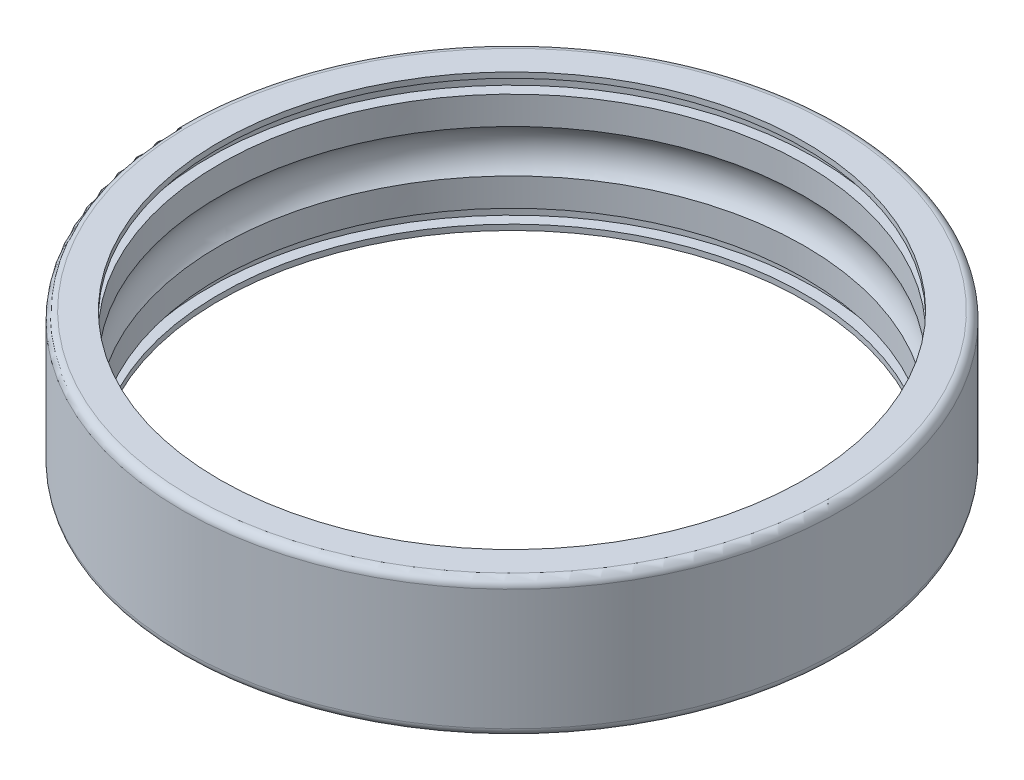
ISO-10303-21;
HEADER;
FILE_DESCRIPTION(('STEP AP214'),'2;1');
FILE_NAME('part.step','',(''),(''),'','','');
FILE_SCHEMA(('AUTOMOTIVE_DESIGN { 1 0 10303 214 1 1 1 1 }'));
ENDSEC;
DATA;
#1=APPLICATION_CONTEXT('core data for automotive mechanical design processes');
#2=APPLICATION_PROTOCOL_DEFINITION('international standard','automotive_design',2000,#1);
#3=PRODUCT_CONTEXT('',#1,'mechanical');
#4=PRODUCT('Part','Part','',(#3));
#5=PRODUCT_RELATED_PRODUCT_CATEGORY('part','',(#4));
#6=PRODUCT_DEFINITION_FORMATION('','',#4);
#7=PRODUCT_DEFINITION_CONTEXT('part definition',#1,'design');
#8=PRODUCT_DEFINITION('design','',#6,#7);
#9=PRODUCT_DEFINITION_SHAPE('','',#8);
#10=(LENGTH_UNIT() NAMED_UNIT(*) SI_UNIT(.MILLI.,.METRE.));
#11=(NAMED_UNIT(*) PLANE_ANGLE_UNIT() SI_UNIT($,.RADIAN.));
#12=(NAMED_UNIT(*) SI_UNIT($,.STERADIAN.) SOLID_ANGLE_UNIT());
#13=UNCERTAINTY_MEASURE_WITH_UNIT(LENGTH_MEASURE(1.E-05),#10,'distance_accuracy_value','');
#14=(GEOMETRIC_REPRESENTATION_CONTEXT(3) GLOBAL_UNCERTAINTY_ASSIGNED_CONTEXT((#13)) GLOBAL_UNIT_ASSIGNED_CONTEXT((#10,
#11,#12)) REPRESENTATION_CONTEXT('',''));
#15=CARTESIAN_POINT('',(0.,0.,0.));
#16=DIRECTION('',(0.,0.,1.));
#17=DIRECTION('',(1.,0.,0.));
#18=AXIS2_PLACEMENT_3D('',#15,#16,#17);
#19=CARTESIAN_POINT('',(0.,-2.75,0.));
#20=DIRECTION('',(0.,1.,0.));
#21=DIRECTION('',(0.,0.,-1.));
#22=AXIS2_PLACEMENT_3D('',#19,#20,#21);
#23=CYLINDRICAL_SURFACE('',#22,10.65);
#24=CARTESIAN_POINT('',(0.,-1.8,0.));
#25=DIRECTION('',(0.,1.,0.));
#26=DIRECTION('',(0.,0.,-1.));
#27=AXIS2_PLACEMENT_3D('',#24,#25,#26);
#28=CIRCLE('',#27,10.65);
#29=CARTESIAN_POINT('',(0.,-1.8,10.65));
#30=VERTEX_POINT('',#29);
#31=EDGE_CURVE('E11',#30,#30,#28,.T.);
#32=ORIENTED_EDGE('',*,*,#31,.F.);
#33=EDGE_LOOP('',(#32));
#34=FACE_BOUND('',#33,.T.);
#35=CARTESIAN_POINT('',(0.,-0.7804417018586,0.));
#36=DIRECTION('',(0.,1.,0.));
#37=DIRECTION('',(0.,0.,-1.));
#38=AXIS2_PLACEMENT_3D('',#35,#36,#37);
#39=CIRCLE('',#38,10.65);
#40=CARTESIAN_POINT('',(0.,-0.7804417018586,-10.65));
#41=VERTEX_POINT('',#40);
#42=EDGE_CURVE('E101',#41,#41,#39,.T.);
#43=ORIENTED_EDGE('',*,*,#42,.T.);
#44=EDGE_LOOP('',(#43));
#45=FACE_BOUND('',#44,.T.);
#46=ADVANCED_FACE('F17',(#34,#45),#23,.F.);
#47=CARTESIAN_POINT('',(0.,-1.8,0.));
#48=DIRECTION('',(0.,1.,0.));
#49=DIRECTION('',(1.,0.,0.));
#50=AXIS2_PLACEMENT_3D('',#47,#48,#49);
#51=PLANE('',#50);
#52=ORIENTED_EDGE('',*,*,#31,.T.);
#53=EDGE_LOOP('',(#52));
#54=FACE_BOUND('',#53,.T.);
#55=CARTESIAN_POINT('',(0.,-1.8,0.));
#56=DIRECTION('',(0.,-1.,0.));
#57=DIRECTION('',(0.,0.,-1.));
#58=AXIS2_PLACEMENT_3D('',#55,#56,#57);
#59=CIRCLE('',#58,11.05);
#60=CARTESIAN_POINT('',(0.,-1.8,11.05));
#61=VERTEX_POINT('',#60);
#62=EDGE_CURVE('E28',#61,#61,#59,.T.);
#63=ORIENTED_EDGE('',*,*,#62,.T.);
#64=EDGE_LOOP('',(#63));
#65=FACE_BOUND('',#64,.T.);
#66=ADVANCED_FACE('F180',(#54,#65),#51,.F.);
#67=CARTESIAN_POINT('',(0.,-2.75,0.));
#68=DIRECTION('',(0.,1.,0.));
#69=DIRECTION('',(0.,0.,-1.));
#70=AXIS2_PLACEMENT_3D('',#67,#68,#69);
#71=CYLINDRICAL_SURFACE('',#70,11.05);
#72=CARTESIAN_POINT('',(0.,-2.3,0.));
#73=DIRECTION('',(0.,1.,0.));
#74=DIRECTION('',(0.,0.,-1.));
#75=AXIS2_PLACEMENT_3D('',#72,#73,#74);
#76=CIRCLE('',#75,11.05);
#77=CARTESIAN_POINT('',(0.,-2.3,11.05));
#78=VERTEX_POINT('',#77);
#79=EDGE_CURVE('E131',#78,#78,#76,.T.);
#80=ORIENTED_EDGE('',*,*,#79,.F.);
#81=EDGE_LOOP('',(#80));
#82=FACE_BOUND('',#81,.T.);
#83=ORIENTED_EDGE('',*,*,#62,.F.);
#84=EDGE_LOOP('',(#83));
#85=FACE_BOUND('',#84,.T.);
#86=ADVANCED_FACE('F186',(#82,#85),#71,.F.);
#87=CARTESIAN_POINT('',(0.,-2.3,0.));
#88=DIRECTION('',(0.,1.,0.));
#89=DIRECTION('',(1.,0.,0.));
#90=AXIS2_PLACEMENT_3D('',#87,#88,#89);
#91=PLANE('',#90);
#92=CARTESIAN_POINT('',(0.,-2.3,0.));
#93=DIRECTION('',(0.,-1.,0.));
#94=DIRECTION('',(0.,0.,-1.));
#95=AXIS2_PLACEMENT_3D('',#92,#93,#94);
#96=CIRCLE('',#95,10.65);
#97=CARTESIAN_POINT('',(0.,-2.3,10.65));
#98=VERTEX_POINT('',#97);
#99=EDGE_CURVE('E21',#98,#98,#96,.T.);
#100=ORIENTED_EDGE('',*,*,#99,.T.);
#101=EDGE_LOOP('',(#100));
#102=FACE_BOUND('',#101,.T.);
#103=ORIENTED_EDGE('',*,*,#79,.T.);
#104=EDGE_LOOP('',(#103));
#105=FACE_BOUND('',#104,.T.);
#106=ADVANCED_FACE('F198',(#102,#105),#91,.T.);
#107=CARTESIAN_POINT('',(0.,-2.75,0.));
#108=DIRECTION('',(0.,1.,0.));
#109=DIRECTION('',(0.,0.,-1.));
#110=AXIS2_PLACEMENT_3D('',#107,#108,#109);
#111=CYLINDRICAL_SURFACE('',#110,10.65);
#112=CARTESIAN_POINT('',(0.,-2.5,0.));
#113=DIRECTION('',(0.,1.,0.));
#114=DIRECTION('',(0.,0.,-1.));
#115=AXIS2_PLACEMENT_3D('',#112,#113,#114);
#116=CIRCLE('',#115,10.65);
#117=CARTESIAN_POINT('',(0.,-2.5,10.65));
#118=VERTEX_POINT('',#117);
#119=EDGE_CURVE('E122',#118,#118,#116,.T.);
#120=ORIENTED_EDGE('',*,*,#119,.F.);
#121=EDGE_LOOP('',(#120));
#122=FACE_BOUND('',#121,.T.);
#123=ORIENTED_EDGE('',*,*,#99,.F.);
#124=EDGE_LOOP('',(#123));
#125=FACE_BOUND('',#124,.T.);
#126=ADVANCED_FACE('F194',(#122,#125),#111,.F.);
#127=CARTESIAN_POINT('',(0.,-2.5,0.));
#128=DIRECTION('',(0.,1.,0.));
#129=DIRECTION('',(1.,0.,0.));
#130=AXIS2_PLACEMENT_3D('',#127,#128,#129);
#131=PLANE('',#130);
#132=ORIENTED_EDGE('',*,*,#119,.T.);
#133=EDGE_LOOP('',(#132));
#134=FACE_BOUND('',#133,.T.);
#135=CARTESIAN_POINT('',(0.,-2.5,0.));
#136=DIRECTION('',(0.,-1.,0.));
#137=DIRECTION('',(0.,0.,-1.));
#138=AXIS2_PLACEMENT_3D('',#135,#136,#137);
#139=CIRCLE('',#138,11.7);
#140=CARTESIAN_POINT('',(0.,-2.5,11.7));
#141=VERTEX_POINT('',#140);
#142=EDGE_CURVE('E125',#141,#141,#139,.T.);
#143=ORIENTED_EDGE('',*,*,#142,.T.);
#144=EDGE_LOOP('',(#143));
#145=FACE_BOUND('',#144,.T.);
#146=ADVANCED_FACE('F197',(#134,#145),#131,.F.);
#147=CARTESIAN_POINT('',(0.,-2.2,0.));
#148=DIRECTION('',(0.,1.,0.));
#149=DIRECTION('',(0.,0.,-1.));
#150=AXIS2_PLACEMENT_3D('',#147,#148,#149);
#151=TOROIDAL_SURFACE('',#150,11.7,0.3);
#152=CARTESIAN_POINT('',(0.,-2.2,0.));
#153=DIRECTION('',(0.,-1.,0.));
#154=DIRECTION('',(0.,0.,-1.));
#155=AXIS2_PLACEMENT_3D('',#152,#153,#154);
#156=CIRCLE('',#155,12.);
#157=CARTESIAN_POINT('',(0.,-2.2,-12.));
#158=VERTEX_POINT('',#157);
#159=EDGE_CURVE('E130',#158,#158,#156,.T.);
#160=ORIENTED_EDGE('',*,*,#159,.T.);
#161=EDGE_LOOP('',(#160));
#162=FACE_BOUND('',#161,.T.);
#163=ORIENTED_EDGE('',*,*,#142,.F.);
#164=EDGE_LOOP('',(#163));
#165=FACE_BOUND('',#164,.T.);
#166=ADVANCED_FACE('F19',(#162,#165),#151,.T.);
#167=CARTESIAN_POINT('',(0.,-2.75,0.));
#168=DIRECTION('',(0.,1.,0.));
#169=DIRECTION('',(0.,0.,-1.));
#170=AXIS2_PLACEMENT_3D('',#167,#168,#169);
#171=CYLINDRICAL_SURFACE('',#170,12.);
#172=ORIENTED_EDGE('',*,*,#159,.F.);
#173=EDGE_LOOP('',(#172));
#174=FACE_BOUND('',#173,.T.);
#175=CARTESIAN_POINT('',(0.,2.2,0.));
#176=DIRECTION('',(0.,-1.,0.));
#177=DIRECTION('',(0.,0.,-1.));
#178=AXIS2_PLACEMENT_3D('',#175,#176,#177);
#179=CIRCLE('',#178,12.);
#180=CARTESIAN_POINT('',(0.,2.2,12.));
#181=VERTEX_POINT('',#180);
#182=EDGE_CURVE('E120',#181,#181,#179,.T.);
#183=ORIENTED_EDGE('',*,*,#182,.T.);
#184=EDGE_LOOP('',(#183));
#185=FACE_BOUND('',#184,.T.);
#186=ADVANCED_FACE('F170',(#174,#185),#171,.T.);
#187=CARTESIAN_POINT('',(0.,2.2,0.));
#188=DIRECTION('',(0.,1.,0.));
#189=DIRECTION('',(0.,0.,-1.));
#190=AXIS2_PLACEMENT_3D('',#187,#188,#189);
#191=TOROIDAL_SURFACE('',#190,11.7,0.3);
#192=CARTESIAN_POINT('',(0.,2.5,0.));
#193=DIRECTION('',(0.,1.,0.));
#194=DIRECTION('',(0.,0.,-1.));
#195=AXIS2_PLACEMENT_3D('',#192,#193,#194);
#196=CIRCLE('',#195,11.7);
#197=CARTESIAN_POINT('',(0.,2.5,11.7));
#198=VERTEX_POINT('',#197);
#199=EDGE_CURVE('E117',#198,#198,#196,.T.);
#200=ORIENTED_EDGE('',*,*,#199,.F.);
#201=EDGE_LOOP('',(#200));
#202=FACE_BOUND('',#201,.T.);
#203=ORIENTED_EDGE('',*,*,#182,.F.);
#204=EDGE_LOOP('',(#203));
#205=FACE_BOUND('',#204,.T.);
#206=ADVANCED_FACE('F164',(#202,#205),#191,.T.);
#207=CARTESIAN_POINT('',(0.,2.5,0.));
#208=DIRECTION('',(0.,1.,0.));
#209=DIRECTION('',(1.,0.,0.));
#210=AXIS2_PLACEMENT_3D('',#207,#208,#209);
#211=PLANE('',#210);
#212=CARTESIAN_POINT('',(0.,2.5,0.));
#213=DIRECTION('',(0.,-1.,0.));
#214=DIRECTION('',(0.,0.,-1.));
#215=AXIS2_PLACEMENT_3D('',#212,#213,#214);
#216=CIRCLE('',#215,10.65);
#217=CARTESIAN_POINT('',(0.,2.5,10.65));
#218=VERTEX_POINT('',#217);
#219=EDGE_CURVE('E115',#218,#218,#216,.T.);
#220=ORIENTED_EDGE('',*,*,#219,.T.);
#221=EDGE_LOOP('',(#220));
#222=FACE_BOUND('',#221,.T.);
#223=ORIENTED_EDGE('',*,*,#199,.T.);
#224=EDGE_LOOP('',(#223));
#225=FACE_BOUND('',#224,.T.);
#226=ADVANCED_FACE('F158',(#222,#225),#211,.T.);
#227=CARTESIAN_POINT('',(0.,-2.75,0.));
#228=DIRECTION('',(0.,1.,0.));
#229=DIRECTION('',(0.,0.,-1.));
#230=AXIS2_PLACEMENT_3D('',#227,#228,#229);
#231=CYLINDRICAL_SURFACE('',#230,10.65);
#232=CARTESIAN_POINT('',(0.,2.3,0.));
#233=DIRECTION('',(0.,1.,0.));
#234=DIRECTION('',(0.,0.,-1.));
#235=AXIS2_PLACEMENT_3D('',#232,#233,#234);
#236=CIRCLE('',#235,10.65);
#237=CARTESIAN_POINT('',(0.,2.3,10.65));
#238=VERTEX_POINT('',#237);
#239=EDGE_CURVE('E118',#238,#238,#236,.T.);
#240=ORIENTED_EDGE('',*,*,#239,.F.);
#241=EDGE_LOOP('',(#240));
#242=FACE_BOUND('',#241,.T.);
#243=ORIENTED_EDGE('',*,*,#219,.F.);
#244=EDGE_LOOP('',(#243));
#245=FACE_BOUND('',#244,.T.);
#246=ADVANCED_FACE('F155',(#242,#245),#231,.F.);
#247=CARTESIAN_POINT('',(0.,2.3,0.));
#248=DIRECTION('',(0.,1.,0.));
#249=DIRECTION('',(1.,0.,0.));
#250=AXIS2_PLACEMENT_3D('',#247,#248,#249);
#251=PLANE('',#250);
#252=ORIENTED_EDGE('',*,*,#239,.T.);
#253=EDGE_LOOP('',(#252));
#254=FACE_BOUND('',#253,.T.);
#255=CARTESIAN_POINT('',(0.,2.3,0.));
#256=DIRECTION('',(0.,-1.,0.));
#257=DIRECTION('',(0.,0.,-1.));
#258=AXIS2_PLACEMENT_3D('',#255,#256,#257);
#259=CIRCLE('',#258,11.05);
#260=CARTESIAN_POINT('',(0.,2.3,11.05));
#261=VERTEX_POINT('',#260);
#262=EDGE_CURVE('E107',#261,#261,#259,.T.);
#263=ORIENTED_EDGE('',*,*,#262,.T.);
#264=EDGE_LOOP('',(#263));
#265=FACE_BOUND('',#264,.T.);
#266=ADVANCED_FACE('F153',(#254,#265),#251,.F.);
#267=CARTESIAN_POINT('',(0.,-2.75,0.));
#268=DIRECTION('',(0.,1.,0.));
#269=DIRECTION('',(0.,0.,-1.));
#270=AXIS2_PLACEMENT_3D('',#267,#268,#269);
#271=CYLINDRICAL_SURFACE('',#270,11.05);
#272=CARTESIAN_POINT('',(0.,1.8,0.));
#273=DIRECTION('',(0.,1.,0.));
#274=DIRECTION('',(0.,0.,-1.));
#275=AXIS2_PLACEMENT_3D('',#272,#273,#274);
#276=CIRCLE('',#275,11.05);
#277=CARTESIAN_POINT('',(0.,1.8,11.05));
#278=VERTEX_POINT('',#277);
#279=EDGE_CURVE('E100',#278,#278,#276,.T.);
#280=ORIENTED_EDGE('',*,*,#279,.F.);
#281=EDGE_LOOP('',(#280));
#282=FACE_BOUND('',#281,.T.);
#283=ORIENTED_EDGE('',*,*,#262,.F.);
#284=EDGE_LOOP('',(#283));
#285=FACE_BOUND('',#284,.T.);
#286=ADVANCED_FACE('F193',(#282,#285),#271,.F.);
#287=CARTESIAN_POINT('',(0.,1.8,0.));
#288=DIRECTION('',(0.,1.,0.));
#289=DIRECTION('',(1.,0.,0.));
#290=AXIS2_PLACEMENT_3D('',#287,#288,#289);
#291=PLANE('',#290);
#292=CARTESIAN_POINT('',(0.,1.8,0.));
#293=DIRECTION('',(0.,-1.,0.));
#294=DIRECTION('',(0.,0.,-1.));
#295=AXIS2_PLACEMENT_3D('',#292,#293,#294);
#296=CIRCLE('',#295,10.65);
#297=CARTESIAN_POINT('',(0.,1.8,-10.65));
#298=VERTEX_POINT('',#297);
#299=EDGE_CURVE('E95',#298,#298,#296,.T.);
#300=ORIENTED_EDGE('',*,*,#299,.T.);
#301=EDGE_LOOP('',(#300));
#302=FACE_BOUND('',#301,.T.);
#303=ORIENTED_EDGE('',*,*,#279,.T.);
#304=EDGE_LOOP('',(#303));
#305=FACE_BOUND('',#304,.T.);
#306=ADVANCED_FACE('F96',(#302,#305),#291,.T.);
#307=CARTESIAN_POINT('',(0.,-2.75,0.));
#308=DIRECTION('',(0.,1.,0.));
#309=DIRECTION('',(0.,0.,-1.));
#310=AXIS2_PLACEMENT_3D('',#307,#308,#309);
#311=CYLINDRICAL_SURFACE('',#310,10.65);
#312=ORIENTED_EDGE('',*,*,#299,.F.);
#313=EDGE_LOOP('',(#312));
#314=FACE_BOUND('',#313,.T.);
#315=CARTESIAN_POINT('',(0.,0.7804417018586,0.));
#316=DIRECTION('',(0.,-1.,0.));
#317=DIRECTION('',(0.,0.,-1.));
#318=AXIS2_PLACEMENT_3D('',#315,#316,#317);
#319=CIRCLE('',#318,10.65);
#320=CARTESIAN_POINT('',(0.,0.7804417018586,10.65));
#321=VERTEX_POINT('',#320);
#322=EDGE_CURVE('E110',#321,#321,#319,.T.);
#323=ORIENTED_EDGE('',*,*,#322,.T.);
#324=EDGE_LOOP('',(#323));
#325=FACE_BOUND('',#324,.T.);
#326=ADVANCED_FACE('F192',(#314,#325),#311,.F.);
#327=CARTESIAN_POINT('',(0.,0.,0.));
#328=DIRECTION('',(0.,1.,0.));
#329=DIRECTION('',(0.,0.,-1.));
#330=AXIS2_PLACEMENT_3D('',#327,#328,#329);
#331=TOROIDAL_SURFACE('',#330,9.751,1.1905);
#332=ORIENTED_EDGE('',*,*,#42,.F.);
#333=EDGE_LOOP('',(#332));
#334=FACE_BOUND('',#333,.T.);
#335=ORIENTED_EDGE('',*,*,#322,.F.);
#336=EDGE_LOOP('',(#335));
#337=FACE_BOUND('',#336,.T.);
#338=ADVANCED_FACE('F204',(#334,#337),#331,.F.);
#339=CLOSED_SHELL('',(#46,#66,#86,#106,#126,#146,#166,#186,#206,#226,#246,#266,#286,#306,#326,#338));
#340=MANIFOLD_SOLID_BREP('B1',#339);
#341=ADVANCED_BREP_SHAPE_REPRESENTATION('',(#18,#340),#14);
#342=SHAPE_DEFINITION_REPRESENTATION(#9,#341);
ENDSEC;
END-ISO-10303-21;
